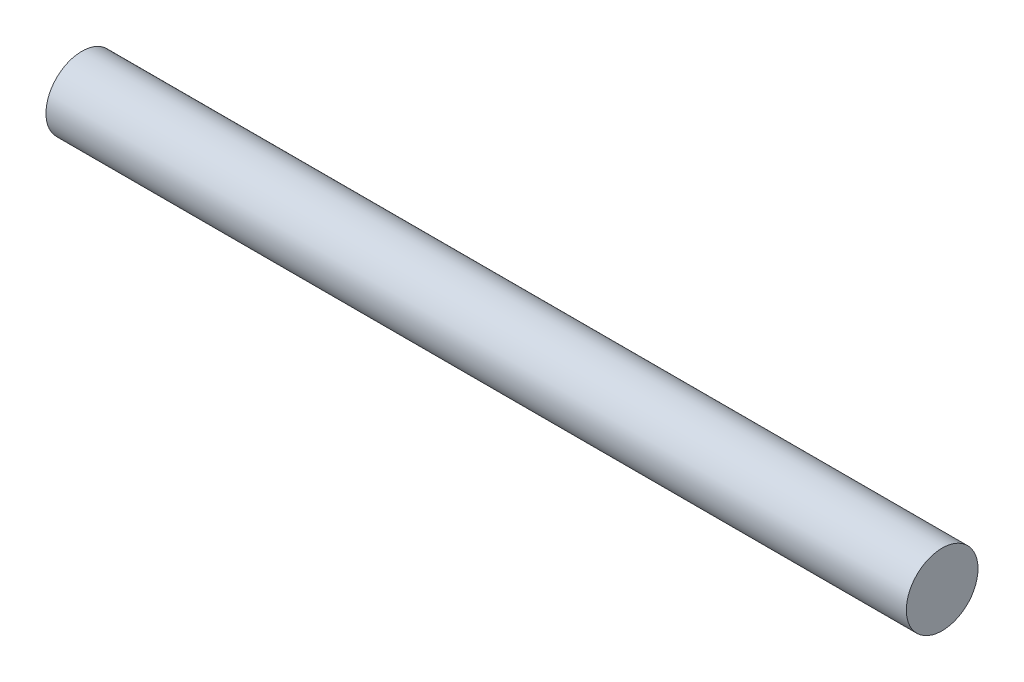
ISO-10303-21;
HEADER;
FILE_DESCRIPTION(('STEP AP214'),'2;1');
FILE_NAME('part.step','',(''),(''),'','','');
FILE_SCHEMA(('AUTOMOTIVE_DESIGN { 1 0 10303 214 1 1 1 1 }'));
ENDSEC;
DATA;
#1=APPLICATION_CONTEXT('core data for automotive mechanical design processes');
#2=APPLICATION_PROTOCOL_DEFINITION('international standard','automotive_design',2000,#1);
#3=PRODUCT_CONTEXT('',#1,'mechanical');
#4=PRODUCT('Part','Part','',(#3));
#5=PRODUCT_RELATED_PRODUCT_CATEGORY('part','',(#4));
#6=PRODUCT_DEFINITION_FORMATION('','',#4);
#7=PRODUCT_DEFINITION_CONTEXT('part definition',#1,'design');
#8=PRODUCT_DEFINITION('design','',#6,#7);
#9=PRODUCT_DEFINITION_SHAPE('','',#8);
#10=(LENGTH_UNIT() NAMED_UNIT(*) SI_UNIT(.MILLI.,.METRE.));
#11=(NAMED_UNIT(*) PLANE_ANGLE_UNIT() SI_UNIT($,.RADIAN.));
#12=(NAMED_UNIT(*) SI_UNIT($,.STERADIAN.) SOLID_ANGLE_UNIT());
#13=UNCERTAINTY_MEASURE_WITH_UNIT(LENGTH_MEASURE(1.E-05),#10,'distance_accuracy_value','');
#14=(GEOMETRIC_REPRESENTATION_CONTEXT(3) GLOBAL_UNCERTAINTY_ASSIGNED_CONTEXT((#13)) GLOBAL_UNIT_ASSIGNED_CONTEXT((#10,
#11,#12)) REPRESENTATION_CONTEXT('',''));
#15=CARTESIAN_POINT('',(0.,0.,0.));
#16=DIRECTION('',(0.,0.,1.));
#17=DIRECTION('',(1.,0.,0.));
#18=AXIS2_PLACEMENT_3D('',#15,#16,#17);
#19=CARTESIAN_POINT('',(30.,0.,0.));
#20=DIRECTION('',(-1.,0.,0.));
#21=DIRECTION('',(0.,0.,1.));
#22=AXIS2_PLACEMENT_3D('',#19,#20,#21);
#23=CYLINDRICAL_SURFACE('',#22,2.5);
#24=CARTESIAN_POINT('',(30.,0.,0.));
#25=DIRECTION('',(1.,0.,0.));
#26=DIRECTION('',(0.,0.,-1.));
#27=AXIS2_PLACEMENT_3D('',#24,#25,#26);
#28=CIRCLE('',#27,2.5);
#29=CARTESIAN_POINT('',(30.,0.,-2.5));
#30=VERTEX_POINT('',#29);
#31=EDGE_CURVE('E10',#30,#30,#28,.T.);
#32=ORIENTED_EDGE('',*,*,#31,.F.);
#33=EDGE_LOOP('',(#32));
#34=FACE_BOUND('',#33,.T.);
#35=CARTESIAN_POINT('',(-30.,0.,0.));
#36=DIRECTION('',(1.,0.,0.));
#37=DIRECTION('',(0.,0.,-1.));
#38=AXIS2_PLACEMENT_3D('',#35,#36,#37);
#39=CIRCLE('',#38,2.5);
#40=CARTESIAN_POINT('',(-30.,0.,-2.5));
#41=VERTEX_POINT('',#40);
#42=EDGE_CURVE('E40',#41,#41,#39,.T.);
#43=ORIENTED_EDGE('',*,*,#42,.T.);
#44=EDGE_LOOP('',(#43));
#45=FACE_BOUND('',#44,.T.);
#46=ADVANCED_FACE('F37',(#34,#45),#23,.T.);
#47=CARTESIAN_POINT('',(30.,0.,0.));
#48=DIRECTION('',(1.,0.,0.));
#49=DIRECTION('',(0.,0.,-1.));
#50=AXIS2_PLACEMENT_3D('',#47,#48,#49);
#51=PLANE('',#50);
#52=ORIENTED_EDGE('',*,*,#31,.T.);
#53=EDGE_LOOP('',(#52));
#54=FACE_BOUND('',#53,.T.);
#55=ADVANCED_FACE('F52',(#54),#51,.T.);
#56=CARTESIAN_POINT('',(-30.,0.,0.));
#57=DIRECTION('',(1.,0.,0.));
#58=DIRECTION('',(0.,0.,-1.));
#59=AXIS2_PLACEMENT_3D('',#56,#57,#58);
#60=PLANE('',#59);
#61=ORIENTED_EDGE('',*,*,#42,.F.);
#62=EDGE_LOOP('',(#61));
#63=FACE_BOUND('',#62,.T.);
#64=ADVANCED_FACE('F50',(#63),#60,.F.);
#65=CLOSED_SHELL('',(#46,#55,#64));
#66=MANIFOLD_SOLID_BREP('B2',#65);
#67=ADVANCED_BREP_SHAPE_REPRESENTATION('',(#18,#66),#14);
#68=SHAPE_DEFINITION_REPRESENTATION(#9,#67);
ENDSEC;
END-ISO-10303-21;
